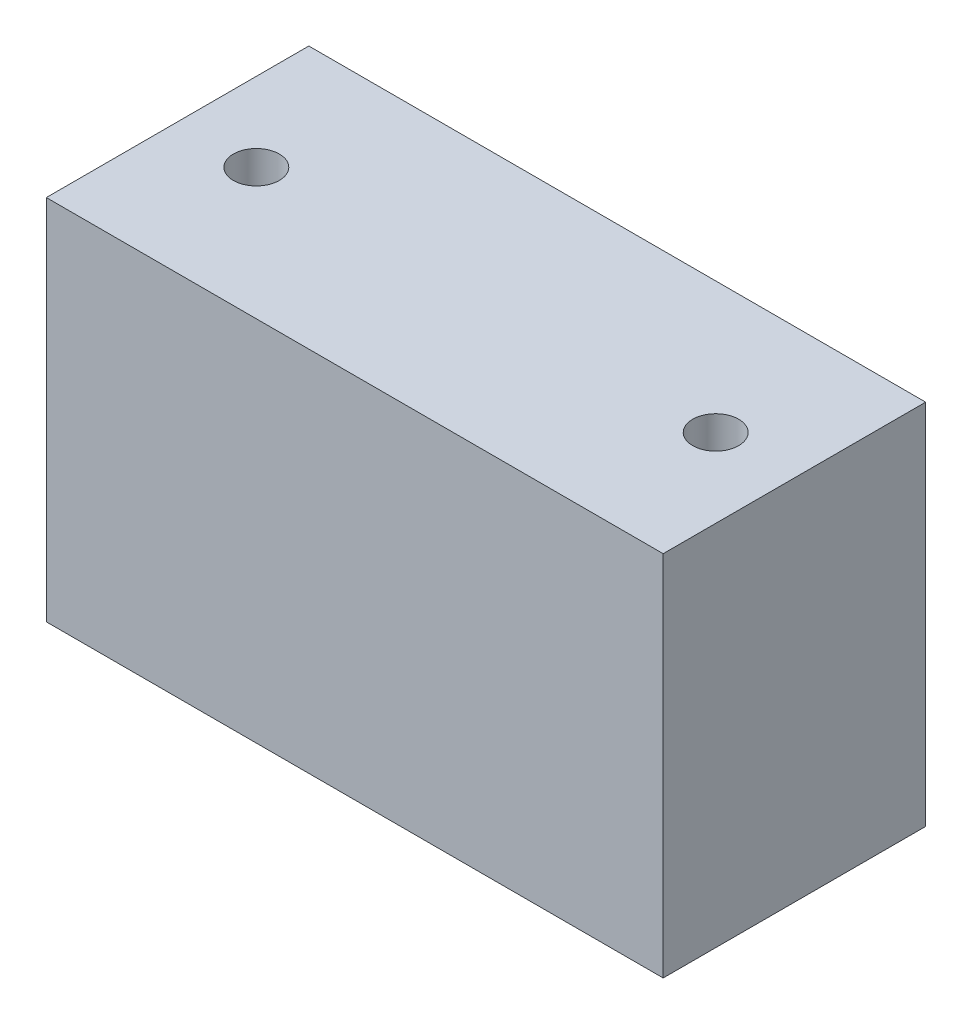
ISO-10303-21;
HEADER;
FILE_DESCRIPTION(('STEP AP214'),'2;1');
FILE_NAME('part.step','',(''),(''),'','','');
FILE_SCHEMA(('AUTOMOTIVE_DESIGN { 1 0 10303 214 1 1 1 1 }'));
ENDSEC;
DATA;
#1=APPLICATION_CONTEXT('core data for automotive mechanical design processes');
#2=APPLICATION_PROTOCOL_DEFINITION('international standard','automotive_design',2000,#1);
#3=PRODUCT_CONTEXT('',#1,'mechanical');
#4=PRODUCT('Part','Part','',(#3));
#5=PRODUCT_RELATED_PRODUCT_CATEGORY('part','',(#4));
#6=PRODUCT_DEFINITION_FORMATION('','',#4);
#7=PRODUCT_DEFINITION_CONTEXT('part definition',#1,'design');
#8=PRODUCT_DEFINITION('design','',#6,#7);
#9=PRODUCT_DEFINITION_SHAPE('','',#8);
#10=(LENGTH_UNIT() NAMED_UNIT(*) SI_UNIT(.MILLI.,.METRE.));
#11=(NAMED_UNIT(*) PLANE_ANGLE_UNIT() SI_UNIT($,.RADIAN.));
#12=(NAMED_UNIT(*) SI_UNIT($,.STERADIAN.) SOLID_ANGLE_UNIT());
#13=UNCERTAINTY_MEASURE_WITH_UNIT(LENGTH_MEASURE(1.E-05),#10,'distance_accuracy_value','');
#14=(GEOMETRIC_REPRESENTATION_CONTEXT(3) GLOBAL_UNCERTAINTY_ASSIGNED_CONTEXT((#13)) GLOBAL_UNIT_ASSIGNED_CONTEXT((#10,
#11,#12)) REPRESENTATION_CONTEXT('',''));
#15=CARTESIAN_POINT('',(0.,0.,0.));
#16=DIRECTION('',(0.,0.,1.));
#17=DIRECTION('',(1.,0.,0.));
#18=AXIS2_PLACEMENT_3D('',#15,#16,#17);
#19=CARTESIAN_POINT('',(23.5,28.,-10.));
#20=DIRECTION('',(-1.,0.,0.));
#21=DIRECTION('',(0.,0.,1.));
#22=AXIS2_PLACEMENT_3D('',#19,#20,#21);
#23=PLANE('',#22);
#24=DIRECTION('',(0.,0.,-1.));
#25=VECTOR('',#24,1.);
#26=CARTESIAN_POINT('',(23.5,0.,-10.));
#27=LINE('',#26,#25);
#28=CARTESIAN_POINT('',(23.5,0.,10.));
#29=VERTEX_POINT('',#28);
#30=CARTESIAN_POINT('',(23.5,0.,-10.));
#31=VERTEX_POINT('',#30);
#32=EDGE_CURVE('E113',#29,#31,#27,.T.);
#33=ORIENTED_EDGE('',*,*,#32,.T.);
#34=DIRECTION('',(0.,-1.,0.));
#35=VECTOR('',#34,1.);
#36=CARTESIAN_POINT('',(23.5,28.,-10.));
#37=LINE('',#36,#35);
#38=CARTESIAN_POINT('',(23.5,28.,-10.));
#39=VERTEX_POINT('',#38);
#40=EDGE_CURVE('E11',#39,#31,#37,.T.);
#41=ORIENTED_EDGE('',*,*,#40,.F.);
#42=DIRECTION('',(0.,0.,-1.));
#43=VECTOR('',#42,1.);
#44=CARTESIAN_POINT('',(23.5,28.,-10.));
#45=LINE('',#44,#43);
#46=CARTESIAN_POINT('',(23.5,28.,10.));
#47=VERTEX_POINT('',#46);
#48=EDGE_CURVE('E97',#47,#39,#45,.T.);
#49=ORIENTED_EDGE('',*,*,#48,.F.);
#50=DIRECTION('',(0.,-1.,0.));
#51=VECTOR('',#50,1.);
#52=CARTESIAN_POINT('',(23.5,28.,10.));
#53=LINE('',#52,#51);
#54=EDGE_CURVE('E109',#47,#29,#53,.T.);
#55=ORIENTED_EDGE('',*,*,#54,.T.);
#56=EDGE_LOOP('',(#33,#41,#49,#55));
#57=FACE_BOUND('',#56,.T.);
#58=ADVANCED_FACE('F45',(#57),#23,.F.);
#59=CARTESIAN_POINT('',(-23.5,28.,-10.));
#60=DIRECTION('',(0.,0.,1.));
#61=DIRECTION('',(1.,0.,0.));
#62=AXIS2_PLACEMENT_3D('',#59,#60,#61);
#63=PLANE('',#62);
#64=DIRECTION('',(-1.,0.,0.));
#65=VECTOR('',#64,1.);
#66=CARTESIAN_POINT('',(-23.5,0.,-10.));
#67=LINE('',#66,#65);
#68=CARTESIAN_POINT('',(-23.5,0.,-10.));
#69=VERTEX_POINT('',#68);
#70=EDGE_CURVE('E102',#31,#69,#67,.T.);
#71=ORIENTED_EDGE('',*,*,#70,.T.);
#72=DIRECTION('',(0.,-1.,0.));
#73=VECTOR('',#72,1.);
#74=CARTESIAN_POINT('',(-23.5,28.,-10.));
#75=LINE('',#74,#73);
#76=CARTESIAN_POINT('',(-23.5,28.,-10.));
#77=VERTEX_POINT('',#76);
#78=EDGE_CURVE('E54',#77,#69,#75,.T.);
#79=ORIENTED_EDGE('',*,*,#78,.F.);
#80=DIRECTION('',(-1.,0.,0.));
#81=VECTOR('',#80,1.);
#82=CARTESIAN_POINT('',(-23.5,28.,-10.));
#83=LINE('',#82,#81);
#84=EDGE_CURVE('E92',#39,#77,#83,.T.);
#85=ORIENTED_EDGE('',*,*,#84,.F.);
#86=ORIENTED_EDGE('',*,*,#40,.T.);
#87=EDGE_LOOP('',(#71,#79,#85,#86));
#88=FACE_BOUND('',#87,.T.);
#89=ADVANCED_FACE('F101',(#88),#63,.F.);
#90=CARTESIAN_POINT('',(-23.5,28.,-10.));
#91=DIRECTION('',(1.,0.,0.));
#92=DIRECTION('',(0.,0.,-1.));
#93=AXIS2_PLACEMENT_3D('',#90,#91,#92);
#94=PLANE('',#93);
#95=DIRECTION('',(0.,0.,1.));
#96=VECTOR('',#95,1.);
#97=CARTESIAN_POINT('',(-23.5,0.,-10.));
#98=LINE('',#97,#96);
#99=CARTESIAN_POINT('',(-23.5,0.,10.));
#100=VERTEX_POINT('',#99);
#101=EDGE_CURVE('E79',#69,#100,#98,.T.);
#102=ORIENTED_EDGE('',*,*,#101,.T.);
#103=DIRECTION('',(0.,-1.,0.));
#104=VECTOR('',#103,1.);
#105=CARTESIAN_POINT('',(-23.5,28.,10.));
#106=LINE('',#105,#104);
#107=CARTESIAN_POINT('',(-23.5,28.,10.));
#108=VERTEX_POINT('',#107);
#109=EDGE_CURVE('E104',#108,#100,#106,.T.);
#110=ORIENTED_EDGE('',*,*,#109,.F.);
#111=DIRECTION('',(0.,0.,1.));
#112=VECTOR('',#111,1.);
#113=CARTESIAN_POINT('',(-23.5,28.,-10.));
#114=LINE('',#113,#112);
#115=EDGE_CURVE('E95',#77,#108,#114,.T.);
#116=ORIENTED_EDGE('',*,*,#115,.F.);
#117=ORIENTED_EDGE('',*,*,#78,.T.);
#118=EDGE_LOOP('',(#102,#110,#116,#117));
#119=FACE_BOUND('',#118,.T.);
#120=ADVANCED_FACE('F105',(#119),#94,.F.);
#121=CARTESIAN_POINT('',(-23.5,28.,10.));
#122=DIRECTION('',(0.,0.,-1.));
#123=DIRECTION('',(-1.,0.,0.));
#124=AXIS2_PLACEMENT_3D('',#121,#122,#123);
#125=PLANE('',#124);
#126=DIRECTION('',(1.,0.,0.));
#127=VECTOR('',#126,1.);
#128=CARTESIAN_POINT('',(-23.5,0.,10.));
#129=LINE('',#128,#127);
#130=EDGE_CURVE('E85',#100,#29,#129,.T.);
#131=ORIENTED_EDGE('',*,*,#130,.T.);
#132=ORIENTED_EDGE('',*,*,#54,.F.);
#133=DIRECTION('',(1.,0.,0.));
#134=VECTOR('',#133,1.);
#135=CARTESIAN_POINT('',(-23.5,28.,10.));
#136=LINE('',#135,#134);
#137=EDGE_CURVE('E62',#108,#47,#136,.T.);
#138=ORIENTED_EDGE('',*,*,#137,.F.);
#139=ORIENTED_EDGE('',*,*,#109,.T.);
#140=EDGE_LOOP('',(#131,#132,#138,#139));
#141=FACE_BOUND('',#140,.T.);
#142=ADVANCED_FACE('F127',(#141),#125,.F.);
#143=CARTESIAN_POINT('',(0.,28.,0.));
#144=DIRECTION('',(0.,1.,0.));
#145=DIRECTION('',(0.,0.,1.));
#146=AXIS2_PLACEMENT_3D('',#143,#144,#145);
#147=PLANE('',#146);
#148=CARTESIAN_POINT('',(-17.5,28.,0.));
#149=DIRECTION('',(0.,1.,0.));
#150=DIRECTION('',(0.,0.,1.));
#151=AXIS2_PLACEMENT_3D('',#148,#149,#150);
#152=CIRCLE('',#151,1.75);
#153=CARTESIAN_POINT('',(-17.5,28.,1.75));
#154=VERTEX_POINT('',#153);
#155=EDGE_CURVE('E142',#154,#154,#152,.T.);
#156=ORIENTED_EDGE('',*,*,#155,.F.);
#157=EDGE_LOOP('',(#156));
#158=FACE_BOUND('',#157,.T.);
#159=CARTESIAN_POINT('',(17.5,28.,0.));
#160=DIRECTION('',(0.,1.,0.));
#161=DIRECTION('',(0.,0.,1.));
#162=AXIS2_PLACEMENT_3D('',#159,#160,#161);
#163=CIRCLE('',#162,1.75);
#164=CARTESIAN_POINT('',(17.5,28.,1.75));
#165=VERTEX_POINT('',#164);
#166=EDGE_CURVE('E138',#165,#165,#163,.T.);
#167=ORIENTED_EDGE('',*,*,#166,.F.);
#168=EDGE_LOOP('',(#167));
#169=FACE_BOUND('',#168,.T.);
#170=ORIENTED_EDGE('',*,*,#48,.T.);
#171=ORIENTED_EDGE('',*,*,#84,.T.);
#172=ORIENTED_EDGE('',*,*,#115,.T.);
#173=ORIENTED_EDGE('',*,*,#137,.T.);
#174=EDGE_LOOP('',(#170,#171,#172,#173));
#175=FACE_BOUND('',#174,.T.);
#176=ADVANCED_FACE('F93',(#158,#169,#175),#147,.T.);
#177=CARTESIAN_POINT('',(0.,0.,0.));
#178=DIRECTION('',(0.,1.,0.));
#179=DIRECTION('',(0.,0.,1.));
#180=AXIS2_PLACEMENT_3D('',#177,#178,#179);
#181=PLANE('',#180);
#182=CARTESIAN_POINT('',(-17.5,0.,0.));
#183=DIRECTION('',(0.,1.,0.));
#184=DIRECTION('',(0.,0.,1.));
#185=AXIS2_PLACEMENT_3D('',#182,#183,#184);
#186=CIRCLE('',#185,1.75);
#187=CARTESIAN_POINT('',(-17.5,0.,1.75));
#188=VERTEX_POINT('',#187);
#189=EDGE_CURVE('E117',#188,#188,#186,.T.);
#190=ORIENTED_EDGE('',*,*,#189,.T.);
#191=EDGE_LOOP('',(#190));
#192=FACE_BOUND('',#191,.T.);
#193=CARTESIAN_POINT('',(17.5,0.,0.));
#194=DIRECTION('',(0.,1.,0.));
#195=DIRECTION('',(0.,0.,1.));
#196=AXIS2_PLACEMENT_3D('',#193,#194,#195);
#197=CIRCLE('',#196,1.75);
#198=CARTESIAN_POINT('',(17.5,0.,1.75));
#199=VERTEX_POINT('',#198);
#200=EDGE_CURVE('E134',#199,#199,#197,.T.);
#201=ORIENTED_EDGE('',*,*,#200,.T.);
#202=EDGE_LOOP('',(#201));
#203=FACE_BOUND('',#202,.T.);
#204=ORIENTED_EDGE('',*,*,#32,.F.);
#205=ORIENTED_EDGE('',*,*,#130,.F.);
#206=ORIENTED_EDGE('',*,*,#101,.F.);
#207=ORIENTED_EDGE('',*,*,#70,.F.);
#208=EDGE_LOOP('',(#204,#205,#206,#207));
#209=FACE_BOUND('',#208,.T.);
#210=ADVANCED_FACE('F130',(#192,#203,#209),#181,.F.);
#211=CARTESIAN_POINT('',(17.5,0.,0.));
#212=DIRECTION('',(0.,1.,0.));
#213=DIRECTION('',(0.,0.,1.));
#214=AXIS2_PLACEMENT_3D('',#211,#212,#213);
#215=CYLINDRICAL_SURFACE('',#214,1.75);
#216=ORIENTED_EDGE('',*,*,#200,.F.);
#217=EDGE_LOOP('',(#216));
#218=FACE_BOUND('',#217,.T.);
#219=ORIENTED_EDGE('',*,*,#166,.T.);
#220=EDGE_LOOP('',(#219));
#221=FACE_BOUND('',#220,.T.);
#222=ADVANCED_FACE('F155',(#218,#221),#215,.F.);
#223=CARTESIAN_POINT('',(-17.5,0.,0.));
#224=DIRECTION('',(0.,1.,0.));
#225=DIRECTION('',(0.,0.,1.));
#226=AXIS2_PLACEMENT_3D('',#223,#224,#225);
#227=CYLINDRICAL_SURFACE('',#226,1.75);
#228=ORIENTED_EDGE('',*,*,#189,.F.);
#229=EDGE_LOOP('',(#228));
#230=FACE_BOUND('',#229,.T.);
#231=ORIENTED_EDGE('',*,*,#155,.T.);
#232=EDGE_LOOP('',(#231));
#233=FACE_BOUND('',#232,.T.);
#234=ADVANCED_FACE('F152',(#230,#233),#227,.F.);
#235=CLOSED_SHELL('',(#58,#89,#120,#142,#176,#210,#222,#234));
#236=MANIFOLD_SOLID_BREP('B2',#235);
#237=ADVANCED_BREP_SHAPE_REPRESENTATION('',(#18,#236),#14);
#238=SHAPE_DEFINITION_REPRESENTATION(#9,#237);
ENDSEC;
END-ISO-10303-21;
